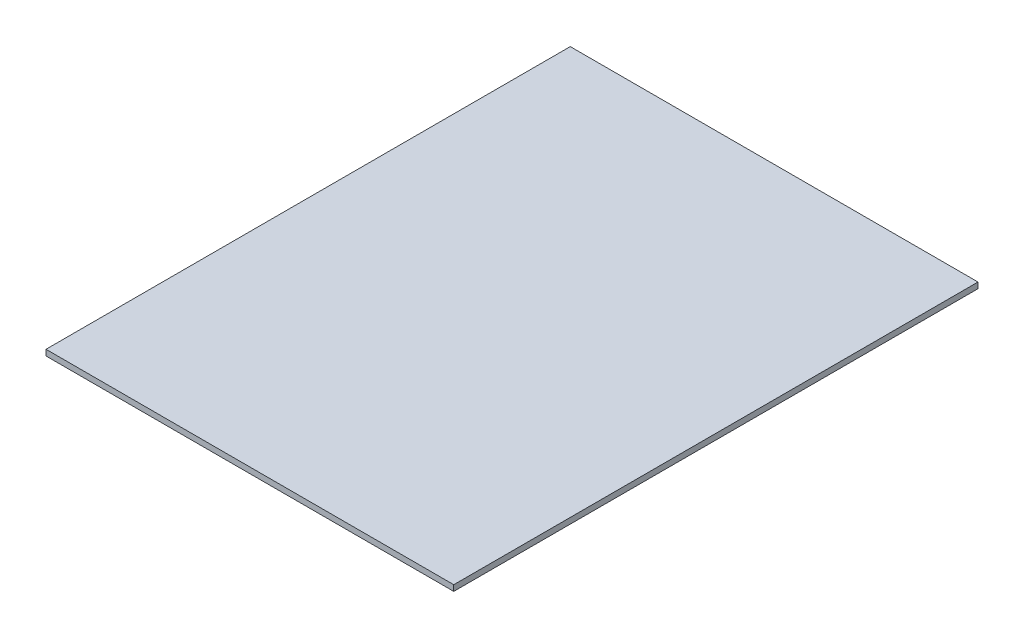
ISO-10303-21;
HEADER;
FILE_DESCRIPTION(('STEP AP214'),'2;1');
FILE_NAME('part.step','',(''),(''),'','','');
FILE_SCHEMA(('AUTOMOTIVE_DESIGN { 1 0 10303 214 1 1 1 1 }'));
ENDSEC;
DATA;
#1=APPLICATION_CONTEXT('core data for automotive mechanical design processes');
#2=APPLICATION_PROTOCOL_DEFINITION('international standard','automotive_design',2000,#1);
#3=PRODUCT_CONTEXT('',#1,'mechanical');
#4=PRODUCT('Part','Part','',(#3));
#5=PRODUCT_RELATED_PRODUCT_CATEGORY('part','',(#4));
#6=PRODUCT_DEFINITION_FORMATION('','',#4);
#7=PRODUCT_DEFINITION_CONTEXT('part definition',#1,'design');
#8=PRODUCT_DEFINITION('design','',#6,#7);
#9=PRODUCT_DEFINITION_SHAPE('','',#8);
#10=(LENGTH_UNIT() NAMED_UNIT(*) SI_UNIT(.MILLI.,.METRE.));
#11=(NAMED_UNIT(*) PLANE_ANGLE_UNIT() SI_UNIT($,.RADIAN.));
#12=(NAMED_UNIT(*) SI_UNIT($,.STERADIAN.) SOLID_ANGLE_UNIT());
#13=UNCERTAINTY_MEASURE_WITH_UNIT(LENGTH_MEASURE(1.E-05),#10,'distance_accuracy_value','');
#14=(GEOMETRIC_REPRESENTATION_CONTEXT(3) GLOBAL_UNCERTAINTY_ASSIGNED_CONTEXT((#13)) GLOBAL_UNIT_ASSIGNED_CONTEXT((#10,
#11,#12)) REPRESENTATION_CONTEXT('',''));
#15=CARTESIAN_POINT('',(0.,0.,0.));
#16=DIRECTION('',(0.,0.,1.));
#17=DIRECTION('',(1.,0.,0.));
#18=AXIS2_PLACEMENT_3D('',#15,#16,#17);
#19=CARTESIAN_POINT('',(35.,1.,45.));
#20=DIRECTION('',(-1.,0.,0.));
#21=DIRECTION('',(0.,0.,1.));
#22=AXIS2_PLACEMENT_3D('',#19,#20,#21);
#23=PLANE('',#22);
#24=DIRECTION('',(0.,0.,-1.));
#25=VECTOR('',#24,1.);
#26=CARTESIAN_POINT('',(35.,0.,45.));
#27=LINE('',#26,#25);
#28=CARTESIAN_POINT('',(35.,0.,45.));
#29=VERTEX_POINT('',#28);
#30=CARTESIAN_POINT('',(35.,0.,-45.));
#31=VERTEX_POINT('',#30);
#32=EDGE_CURVE('E96',#29,#31,#27,.T.);
#33=ORIENTED_EDGE('',*,*,#32,.T.);
#34=DIRECTION('',(0.,-1.,0.));
#35=VECTOR('',#34,1.);
#36=CARTESIAN_POINT('',(35.,1.,-45.));
#37=LINE('',#36,#35);
#38=CARTESIAN_POINT('',(35.,1.,-45.));
#39=VERTEX_POINT('',#38);
#40=EDGE_CURVE('E11',#39,#31,#37,.T.);
#41=ORIENTED_EDGE('',*,*,#40,.F.);
#42=DIRECTION('',(0.,0.,-1.));
#43=VECTOR('',#42,1.);
#44=CARTESIAN_POINT('',(35.,1.,45.));
#45=LINE('',#44,#43);
#46=CARTESIAN_POINT('',(35.,1.,45.));
#47=VERTEX_POINT('',#46);
#48=EDGE_CURVE('E84',#47,#39,#45,.T.);
#49=ORIENTED_EDGE('',*,*,#48,.F.);
#50=DIRECTION('',(0.,-1.,0.));
#51=VECTOR('',#50,1.);
#52=CARTESIAN_POINT('',(35.,1.,45.));
#53=LINE('',#52,#51);
#54=EDGE_CURVE('E92',#47,#29,#53,.T.);
#55=ORIENTED_EDGE('',*,*,#54,.T.);
#56=EDGE_LOOP('',(#33,#41,#49,#55));
#57=FACE_BOUND('',#56,.T.);
#58=ADVANCED_FACE('F33',(#57),#23,.F.);
#59=CARTESIAN_POINT('',(-35.,1.,-45.));
#60=DIRECTION('',(0.,0.,1.));
#61=DIRECTION('',(1.,0.,0.));
#62=AXIS2_PLACEMENT_3D('',#59,#60,#61);
#63=PLANE('',#62);
#64=DIRECTION('',(-1.,0.,0.));
#65=VECTOR('',#64,1.);
#66=CARTESIAN_POINT('',(-35.,0.,-45.));
#67=LINE('',#66,#65);
#68=CARTESIAN_POINT('',(-35.,0.,-45.));
#69=VERTEX_POINT('',#68);
#70=EDGE_CURVE('E88',#31,#69,#67,.T.);
#71=ORIENTED_EDGE('',*,*,#70,.T.);
#72=DIRECTION('',(0.,-1.,0.));
#73=VECTOR('',#72,1.);
#74=CARTESIAN_POINT('',(-35.,1.,-45.));
#75=LINE('',#74,#73);
#76=CARTESIAN_POINT('',(-35.,1.,-45.));
#77=VERTEX_POINT('',#76);
#78=EDGE_CURVE('E41',#77,#69,#75,.T.);
#79=ORIENTED_EDGE('',*,*,#78,.F.);
#80=DIRECTION('',(-1.,0.,0.));
#81=VECTOR('',#80,1.);
#82=CARTESIAN_POINT('',(-35.,1.,-45.));
#83=LINE('',#82,#81);
#84=EDGE_CURVE('E79',#39,#77,#83,.T.);
#85=ORIENTED_EDGE('',*,*,#84,.F.);
#86=ORIENTED_EDGE('',*,*,#40,.T.);
#87=EDGE_LOOP('',(#71,#79,#85,#86));
#88=FACE_BOUND('',#87,.T.);
#89=ADVANCED_FACE('F87',(#88),#63,.F.);
#90=CARTESIAN_POINT('',(-35.,1.,45.));
#91=DIRECTION('',(1.,0.,0.));
#92=DIRECTION('',(0.,0.,-1.));
#93=AXIS2_PLACEMENT_3D('',#90,#91,#92);
#94=PLANE('',#93);
#95=DIRECTION('',(0.,0.,1.));
#96=VECTOR('',#95,1.);
#97=CARTESIAN_POINT('',(-35.,0.,45.));
#98=LINE('',#97,#96);
#99=CARTESIAN_POINT('',(-35.,0.,45.));
#100=VERTEX_POINT('',#99);
#101=EDGE_CURVE('E66',#69,#100,#98,.T.);
#102=ORIENTED_EDGE('',*,*,#101,.T.);
#103=DIRECTION('',(0.,-1.,0.));
#104=VECTOR('',#103,1.);
#105=CARTESIAN_POINT('',(-35.,1.,45.));
#106=LINE('',#105,#104);
#107=CARTESIAN_POINT('',(-35.,1.,45.));
#108=VERTEX_POINT('',#107);
#109=EDGE_CURVE('E89',#108,#100,#106,.T.);
#110=ORIENTED_EDGE('',*,*,#109,.F.);
#111=DIRECTION('',(0.,0.,1.));
#112=VECTOR('',#111,1.);
#113=CARTESIAN_POINT('',(-35.,1.,45.));
#114=LINE('',#113,#112);
#115=EDGE_CURVE('E82',#77,#108,#114,.T.);
#116=ORIENTED_EDGE('',*,*,#115,.F.);
#117=ORIENTED_EDGE('',*,*,#78,.T.);
#118=EDGE_LOOP('',(#102,#110,#116,#117));
#119=FACE_BOUND('',#118,.T.);
#120=ADVANCED_FACE('F90',(#119),#94,.F.);
#121=CARTESIAN_POINT('',(-35.,1.,45.));
#122=DIRECTION('',(0.,0.,-1.));
#123=DIRECTION('',(-1.,0.,0.));
#124=AXIS2_PLACEMENT_3D('',#121,#122,#123);
#125=PLANE('',#124);
#126=DIRECTION('',(1.,0.,0.));
#127=VECTOR('',#126,1.);
#128=CARTESIAN_POINT('',(-35.,0.,45.));
#129=LINE('',#128,#127);
#130=EDGE_CURVE('E72',#100,#29,#129,.T.);
#131=ORIENTED_EDGE('',*,*,#130,.T.);
#132=ORIENTED_EDGE('',*,*,#54,.F.);
#133=DIRECTION('',(1.,0.,0.));
#134=VECTOR('',#133,1.);
#135=CARTESIAN_POINT('',(-35.,1.,45.));
#136=LINE('',#135,#134);
#137=EDGE_CURVE('E49',#108,#47,#136,.T.);
#138=ORIENTED_EDGE('',*,*,#137,.F.);
#139=ORIENTED_EDGE('',*,*,#109,.T.);
#140=EDGE_LOOP('',(#131,#132,#138,#139));
#141=FACE_BOUND('',#140,.T.);
#142=ADVANCED_FACE('F103',(#141),#125,.F.);
#143=CARTESIAN_POINT('',(0.,1.,0.));
#144=DIRECTION('',(0.,-1.,0.));
#145=DIRECTION('',(0.,0.,-1.));
#146=AXIS2_PLACEMENT_3D('',#143,#144,#145);
#147=PLANE('',#146);
#148=ORIENTED_EDGE('',*,*,#48,.T.);
#149=ORIENTED_EDGE('',*,*,#84,.T.);
#150=ORIENTED_EDGE('',*,*,#115,.T.);
#151=ORIENTED_EDGE('',*,*,#137,.T.);
#152=EDGE_LOOP('',(#148,#149,#150,#151));
#153=FACE_BOUND('',#152,.T.);
#154=ADVANCED_FACE('F80',(#153),#147,.F.);
#155=CARTESIAN_POINT('',(0.,0.,0.));
#156=DIRECTION('',(0.,-1.,0.));
#157=DIRECTION('',(0.,0.,-1.));
#158=AXIS2_PLACEMENT_3D('',#155,#156,#157);
#159=PLANE('',#158);
#160=ORIENTED_EDGE('',*,*,#32,.F.);
#161=ORIENTED_EDGE('',*,*,#130,.F.);
#162=ORIENTED_EDGE('',*,*,#101,.F.);
#163=ORIENTED_EDGE('',*,*,#70,.F.);
#164=EDGE_LOOP('',(#160,#161,#162,#163));
#165=FACE_BOUND('',#164,.T.);
#166=ADVANCED_FACE('F106',(#165),#159,.T.);
#167=CLOSED_SHELL('',(#58,#89,#120,#142,#154,#166));
#168=MANIFOLD_SOLID_BREP('B2',#167);
#169=ADVANCED_BREP_SHAPE_REPRESENTATION('',(#18,#168),#14);
#170=SHAPE_DEFINITION_REPRESENTATION(#9,#169);
ENDSEC;
END-ISO-10303-21;
